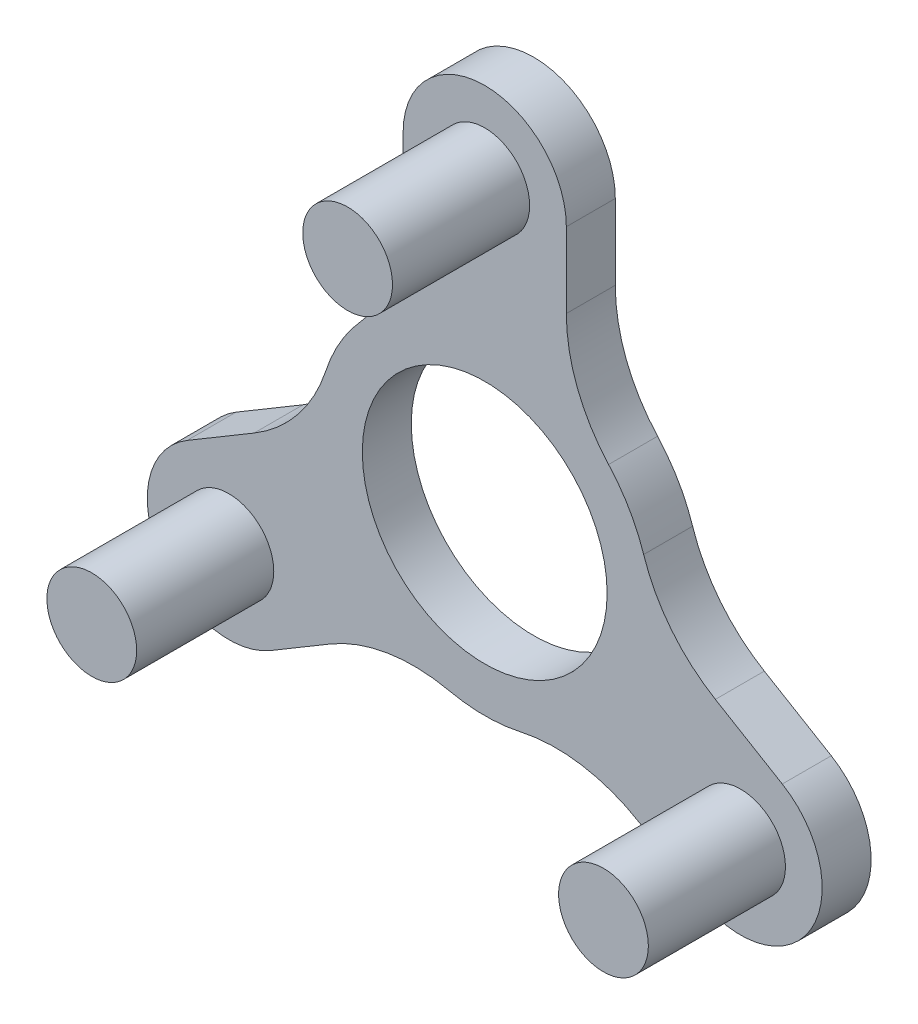
ISO-10303-21;
HEADER;
FILE_DESCRIPTION(('STEP AP214'),'2;1');
FILE_NAME('part.step','',(''),(''),'','','');
FILE_SCHEMA(('AUTOMOTIVE_DESIGN { 1 0 10303 214 1 1 1 1 }'));
ENDSEC;
DATA;
#1=APPLICATION_CONTEXT('core data for automotive mechanical design processes');
#2=APPLICATION_PROTOCOL_DEFINITION('international standard','automotive_design',2000,#1);
#3=PRODUCT_CONTEXT('',#1,'mechanical');
#4=PRODUCT('Part','Part','',(#3));
#5=PRODUCT_RELATED_PRODUCT_CATEGORY('part','',(#4));
#6=PRODUCT_DEFINITION_FORMATION('','',#4);
#7=PRODUCT_DEFINITION_CONTEXT('part definition',#1,'design');
#8=PRODUCT_DEFINITION('design','',#6,#7);
#9=PRODUCT_DEFINITION_SHAPE('','',#8);
#10=(LENGTH_UNIT() NAMED_UNIT(*) SI_UNIT(.MILLI.,.METRE.));
#11=(NAMED_UNIT(*) PLANE_ANGLE_UNIT() SI_UNIT($,.RADIAN.));
#12=(NAMED_UNIT(*) SI_UNIT($,.STERADIAN.) SOLID_ANGLE_UNIT());
#13=UNCERTAINTY_MEASURE_WITH_UNIT(LENGTH_MEASURE(1.E-05),#10,'distance_accuracy_value','');
#14=(GEOMETRIC_REPRESENTATION_CONTEXT(3) GLOBAL_UNCERTAINTY_ASSIGNED_CONTEXT((#13)) GLOBAL_UNIT_ASSIGNED_CONTEXT((#10,
#11,#12)) REPRESENTATION_CONTEXT('',''));
#15=CARTESIAN_POINT('',(0.,0.,0.));
#16=DIRECTION('',(0.,0.,1.));
#17=DIRECTION('',(1.,0.,0.));
#18=AXIS2_PLACEMENT_3D('',#15,#16,#17);
#19=CARTESIAN_POINT('',(-15.6750598084983,-9.05000000000008,3.));
#20=DIRECTION('',(0.,0.,-1.));
#21=DIRECTION('',(-1.,0.,0.));
#22=AXIS2_PLACEMENT_3D('',#19,#20,#21);
#23=CYLINDRICAL_SURFACE('',#22,5.);
#24=CARTESIAN_POINT('',(-15.6750598084983,-9.05000000000008,0.));
#25=DIRECTION('',(0.,0.,1.));
#26=DIRECTION('',(1.,0.,0.));
#27=AXIS2_PLACEMENT_3D('',#24,#25,#26);
#28=CIRCLE('',#27,5.);
#29=CARTESIAN_POINT('',(-18.2317713929619,-4.75311439832654,0.));
#30=VERTEX_POINT('',#29);
#31=CARTESIAN_POINT('',(-13.1183482240346,-13.3468856016736,0.));
#32=VERTEX_POINT('',#31);
#33=EDGE_CURVE('E255',#30,#32,#28,.T.);
#34=ORIENTED_EDGE('',*,*,#33,.T.);
#35=DIRECTION('',(0.,0.,-1.));
#36=VECTOR('',#35,1.);
#37=CARTESIAN_POINT('',(-13.1183482240346,-13.3468856016736,3.));
#38=LINE('',#37,#36);
#39=CARTESIAN_POINT('',(-13.1183482240346,-13.3468856016736,3.));
#40=VERTEX_POINT('',#39);
#41=EDGE_CURVE('E211',#40,#32,#38,.T.);
#42=ORIENTED_EDGE('',*,*,#41,.F.);
#43=CARTESIAN_POINT('',(-15.6750598084983,-9.05000000000008,3.));
#44=DIRECTION('',(0.,0.,1.));
#45=DIRECTION('',(1.,0.,0.));
#46=AXIS2_PLACEMENT_3D('',#43,#44,#45);
#47=CIRCLE('',#46,5.);
#48=CARTESIAN_POINT('',(-18.2317713929619,-4.75311439832654,3.));
#49=VERTEX_POINT('',#48);
#50=EDGE_CURVE('E214',#49,#40,#47,.T.);
#51=ORIENTED_EDGE('',*,*,#50,.F.);
#52=DIRECTION('',(0.,0.,-1.));
#53=VECTOR('',#52,1.);
#54=CARTESIAN_POINT('',(-18.2317713929619,-4.75311439832654,3.));
#55=LINE('',#54,#53);
#56=EDGE_CURVE('E199',#49,#30,#55,.T.);
#57=ORIENTED_EDGE('',*,*,#56,.T.);
#58=EDGE_LOOP('',(#34,#42,#51,#57));
#59=FACE_BOUND('',#58,.T.);
#60=ADVANCED_FACE('F74',(#59),#23,.T.);
#61=CARTESIAN_POINT('',(2.43503335375282,-4.09238954480285,3.));
#62=DIRECTION('',(-0.511342316892728,0.859377120334709,0.));
#63=DIRECTION('',(-0.859377120334709,-0.511342316892728,0.));
#64=AXIS2_PLACEMENT_3D('',#61,#62,#63);
#65=PLANE('',#64);
#66=DIRECTION('',(0.859377120334709,0.511342316892728,0.));
#67=VECTOR('',#66,1.);
#68=CARTESIAN_POINT('',(2.43503335375282,-4.09238954480285,0.));
#69=LINE('',#68,#67);
#70=CARTESIAN_POINT('',(-9.46922520496294,-11.1756025001734,0.));
#71=VERTEX_POINT('',#70);
#72=EDGE_CURVE('E258',#32,#71,#69,.T.);
#73=ORIENTED_EDGE('',*,*,#72,.T.);
#74=DIRECTION('',(0.,0.,1.));
#75=VECTOR('',#74,1.);
#76=CARTESIAN_POINT('',(-9.46922520496294,-11.1756025001734,3.));
#77=LINE('',#76,#75);
#78=CARTESIAN_POINT('',(-9.46922520496294,-11.1756025001734,3.));
#79=VERTEX_POINT('',#78);
#80=EDGE_CURVE('E89',#71,#79,#77,.T.);
#81=ORIENTED_EDGE('',*,*,#80,.T.);
#82=DIRECTION('',(0.859377120334709,0.511342316892728,0.));
#83=VECTOR('',#82,1.);
#84=CARTESIAN_POINT('',(2.43503335375282,-4.09238954480285,3.));
#85=LINE('',#84,#83);
#86=EDGE_CURVE('E217',#40,#79,#85,.T.);
#87=ORIENTED_EDGE('',*,*,#86,.F.);
#88=ORIENTED_EDGE('',*,*,#41,.T.);
#89=EDGE_LOOP('',(#73,#81,#87,#88));
#90=FACE_BOUND('',#89,.T.);
#91=ADVANCED_FACE('F353',(#90),#65,.F.);
#92=CARTESIAN_POINT('',(0.,0.,3.));
#93=DIRECTION('',(0.,0.,-1.));
#94=DIRECTION('',(-1.,0.,0.));
#95=AXIS2_PLACEMENT_3D('',#92,#93,#94);
#96=CYLINDRICAL_SURFACE('',#95,10.2435458358109);
#97=CARTESIAN_POINT('',(0.,0.,0.));
#98=DIRECTION('',(0.,0.,1.));
#99=DIRECTION('',(1.,0.,0.));
#100=AXIS2_PLACEMENT_3D('',#97,#98,#99);
#101=CIRCLE('',#100,10.2435458358109);
#102=CARTESIAN_POINT('',(-2.20410288640831,-10.0036074371442,0.));
#103=VERTEX_POINT('',#102);
#104=CARTESIAN_POINT('',(2.20410288640832,-10.0036074371442,0.));
#105=VERTEX_POINT('',#104);
#106=EDGE_CURVE('E229',#103,#105,#101,.T.);
#107=ORIENTED_EDGE('',*,*,#106,.T.);
#108=DIRECTION('',(0.,0.,-1.));
#109=VECTOR('',#108,1.);
#110=CARTESIAN_POINT('',(2.20410288640832,-10.0036074371442,3.));
#111=LINE('',#110,#109);
#112=CARTESIAN_POINT('',(2.20410288640832,-10.0036074371442,3.));
#113=VERTEX_POINT('',#112);
#114=EDGE_CURVE('E292',#105,#113,#111,.F.);
#115=ORIENTED_EDGE('',*,*,#114,.T.);
#116=CARTESIAN_POINT('',(0.,0.,3.));
#117=DIRECTION('',(0.,0.,1.));
#118=DIRECTION('',(1.,0.,0.));
#119=AXIS2_PLACEMENT_3D('',#116,#117,#118);
#120=CIRCLE('',#119,10.2435458358109);
#121=CARTESIAN_POINT('',(-2.20410288640831,-10.0036074371442,3.));
#122=VERTEX_POINT('',#121);
#123=EDGE_CURVE('E235',#122,#113,#120,.T.);
#124=ORIENTED_EDGE('',*,*,#123,.F.);
#125=DIRECTION('',(0.,0.,-1.));
#126=VECTOR('',#125,1.);
#127=CARTESIAN_POINT('',(-2.20410288640831,-10.0036074371442,3.));
#128=LINE('',#127,#126);
#129=EDGE_CURVE('E289',#122,#103,#128,.T.);
#130=ORIENTED_EDGE('',*,*,#129,.T.);
#131=EDGE_LOOP('',(#107,#115,#124,#130));
#132=FACE_BOUND('',#131,.T.);
#133=ADVANCED_FACE('F358',(#132),#96,.T.);
#134=CARTESIAN_POINT('',(-2.43503335375282,-4.09238954480286,3.));
#135=DIRECTION('',(-0.511342316892728,-0.859377120334709,0.));
#136=DIRECTION('',(0.859377120334709,-0.511342316892728,0.));
#137=AXIS2_PLACEMENT_3D('',#134,#135,#136);
#138=PLANE('',#137);
#139=DIRECTION('',(-0.859377120334709,0.511342316892728,0.));
#140=VECTOR('',#139,1.);
#141=CARTESIAN_POINT('',(-2.43503335375282,-4.09238954480286,3.));
#142=LINE('',#141,#140);
#143=CARTESIAN_POINT('',(13.1183482240346,-13.3468856016736,3.));
#144=VERTEX_POINT('',#143);
#145=CARTESIAN_POINT('',(9.46922520496294,-11.1756025001734,3.));
#146=VERTEX_POINT('',#145);
#147=EDGE_CURVE('E241',#144,#146,#142,.T.);
#148=ORIENTED_EDGE('',*,*,#147,.T.);
#149=DIRECTION('',(0.,0.,-1.));
#150=VECTOR('',#149,1.);
#151=CARTESIAN_POINT('',(9.46922520496294,-11.1756025001734,3.));
#152=LINE('',#151,#150);
#153=CARTESIAN_POINT('',(9.46922520496294,-11.1756025001734,0.));
#154=VERTEX_POINT('',#153);
#155=EDGE_CURVE('E210',#146,#154,#152,.T.);
#156=ORIENTED_EDGE('',*,*,#155,.T.);
#157=DIRECTION('',(-0.859377120334709,0.511342316892728,0.));
#158=VECTOR('',#157,1.);
#159=CARTESIAN_POINT('',(-2.43503335375282,-4.09238954480286,0.));
#160=LINE('',#159,#158);
#161=CARTESIAN_POINT('',(13.1183482240346,-13.3468856016736,0.));
#162=VERTEX_POINT('',#161);
#163=EDGE_CURVE('E260',#162,#154,#160,.T.);
#164=ORIENTED_EDGE('',*,*,#163,.F.);
#165=DIRECTION('',(0.,0.,-1.));
#166=VECTOR('',#165,1.);
#167=CARTESIAN_POINT('',(13.1183482240346,-13.3468856016736,3.));
#168=LINE('',#167,#166);
#169=EDGE_CURVE('E279',#144,#162,#168,.T.);
#170=ORIENTED_EDGE('',*,*,#169,.F.);
#171=EDGE_LOOP('',(#148,#156,#164,#170));
#172=FACE_BOUND('',#171,.T.);
#173=ADVANCED_FACE('F416',(#172),#138,.T.);
#174=CARTESIAN_POINT('',(2.67838981517445,4.50138165854423,3.));
#175=DIRECTION('',(-0.511342316892728,-0.859377120334709,0.));
#176=DIRECTION('',(0.859377120334709,-0.511342316892728,0.));
#177=AXIS2_PLACEMENT_3D('',#174,#175,#176);
#178=PLANE('',#177);
#179=DIRECTION('',(-0.859377120334709,0.511342316892728,0.));
#180=VECTOR('',#179,1.);
#181=CARTESIAN_POINT('',(2.67838981517445,4.50138165854423,0.));
#182=LINE('',#181,#180);
#183=CARTESIAN_POINT('',(18.2317713929619,-4.75311439832654,0.));
#184=VERTEX_POINT('',#183);
#185=CARTESIAN_POINT('',(14.1312068435024,-2.31321679380084,0.));
#186=VERTEX_POINT('',#185);
#187=EDGE_CURVE('E263',#184,#186,#182,.T.);
#188=ORIENTED_EDGE('',*,*,#187,.T.);
#189=DIRECTION('',(0.,0.,1.));
#190=VECTOR('',#189,1.);
#191=CARTESIAN_POINT('',(14.1312068435024,-2.31321679380084,3.));
#192=LINE('',#191,#190);
#193=CARTESIAN_POINT('',(14.1312068435024,-2.31321679380084,3.));
#194=VERTEX_POINT('',#193);
#195=EDGE_CURVE('E299',#186,#194,#192,.T.);
#196=ORIENTED_EDGE('',*,*,#195,.T.);
#197=DIRECTION('',(-0.859377120334709,0.511342316892728,0.));
#198=VECTOR('',#197,1.);
#199=CARTESIAN_POINT('',(2.67838981517445,4.50138165854423,3.));
#200=LINE('',#199,#198);
#201=CARTESIAN_POINT('',(18.2317713929619,-4.75311439832654,3.));
#202=VERTEX_POINT('',#201);
#203=EDGE_CURVE('E244',#202,#194,#200,.T.);
#204=ORIENTED_EDGE('',*,*,#203,.F.);
#205=DIRECTION('',(0.,0.,-1.));
#206=VECTOR('',#205,1.);
#207=CARTESIAN_POINT('',(18.2317713929619,-4.75311439832654,3.));
#208=LINE('',#207,#206);
#209=EDGE_CURVE('E277',#202,#184,#208,.T.);
#210=ORIENTED_EDGE('',*,*,#209,.T.);
#211=EDGE_LOOP('',(#188,#196,#204,#210));
#212=FACE_BOUND('',#211,.T.);
#213=ADVANCED_FACE('F414',(#212),#178,.F.);
#214=CARTESIAN_POINT('',(9.73807905119151,3.17805721834967,3.));
#215=VERTEX_POINT('',#214);
#216=CARTESIAN_POINT('',(7.59023092018547,6.87885352864995,3.));
#217=VERTEX_POINT('',#216);
#218=EDGE_CURVE('E240',#215,#217,#120,.T.);
#219=ORIENTED_EDGE('',*,*,#218,.F.);
#220=DIRECTION('',(0.,0.,-1.));
#221=VECTOR('',#220,1.);
#222=CARTESIAN_POINT('',(9.73807905119151,3.17805721834967,3.));
#223=LINE('',#222,#221);
#224=CARTESIAN_POINT('',(9.73807905119151,3.17805721834967,0.));
#225=VERTEX_POINT('',#224);
#226=EDGE_CURVE('E296',#215,#225,#223,.T.);
#227=ORIENTED_EDGE('',*,*,#226,.T.);
#228=CARTESIAN_POINT('',(7.59023092018547,6.87885352864995,0.));
#229=VERTEX_POINT('',#228);
#230=EDGE_CURVE('E228',#225,#229,#101,.T.);
#231=ORIENTED_EDGE('',*,*,#230,.T.);
#232=DIRECTION('',(0.,0.,-1.));
#233=VECTOR('',#232,1.);
#234=CARTESIAN_POINT('',(7.59023092018547,6.87885352864995,3.));
#235=LINE('',#234,#233);
#236=EDGE_CURVE('E294',#229,#217,#235,.F.);
#237=ORIENTED_EDGE('',*,*,#236,.T.);
#238=EDGE_LOOP('',(#219,#227,#231,#237));
#239=FACE_BOUND('',#238,.T.);
#240=ADVANCED_FACE('F408',(#239),#96,.T.);
#241=CARTESIAN_POINT('',(5.,0.,3.));
#242=DIRECTION('',(1.,0.,0.));
#243=DIRECTION('',(0.,1.,0.));
#244=AXIS2_PLACEMENT_3D('',#241,#242,#243);
#245=PLANE('',#244);
#246=DIRECTION('',(0.,-1.,0.));
#247=VECTOR('',#246,1.);
#248=CARTESIAN_POINT('',(5.,0.,3.));
#249=LINE('',#248,#247);
#250=CARTESIAN_POINT('',(5.,18.2,3.));
#251=VERTEX_POINT('',#250);
#252=CARTESIAN_POINT('',(5.,13.5941585986989,3.));
#253=VERTEX_POINT('',#252);
#254=EDGE_CURVE('E247',#251,#253,#249,.T.);
#255=ORIENTED_EDGE('',*,*,#254,.T.);
#256=DIRECTION('',(0.,0.,-1.));
#257=VECTOR('',#256,1.);
#258=CARTESIAN_POINT('',(5.,13.5941585986989,3.));
#259=LINE('',#258,#257);
#260=CARTESIAN_POINT('',(5.,13.5941585986989,0.));
#261=VERTEX_POINT('',#260);
#262=EDGE_CURVE('E301',#253,#261,#259,.T.);
#263=ORIENTED_EDGE('',*,*,#262,.T.);
#264=DIRECTION('',(0.,-1.,0.));
#265=VECTOR('',#264,1.);
#266=CARTESIAN_POINT('',(5.,0.,0.));
#267=LINE('',#266,#265);
#268=CARTESIAN_POINT('',(5.,18.2,0.));
#269=VERTEX_POINT('',#268);
#270=EDGE_CURVE('E266',#269,#261,#267,.T.);
#271=ORIENTED_EDGE('',*,*,#270,.F.);
#272=DIRECTION('',(0.,0.,-1.));
#273=VECTOR('',#272,1.);
#274=CARTESIAN_POINT('',(5.,18.2,3.));
#275=LINE('',#274,#273);
#276=EDGE_CURVE('E275',#251,#269,#275,.T.);
#277=ORIENTED_EDGE('',*,*,#276,.F.);
#278=EDGE_LOOP('',(#255,#263,#271,#277));
#279=FACE_BOUND('',#278,.T.);
#280=ADVANCED_FACE('F388',(#279),#245,.T.);
#281=CARTESIAN_POINT('',(0.,18.2,3.));
#282=DIRECTION('',(0.,0.,-1.));
#283=DIRECTION('',(-1.,0.,0.));
#284=AXIS2_PLACEMENT_3D('',#281,#282,#283);
#285=CYLINDRICAL_SURFACE('',#284,5.);
#286=CARTESIAN_POINT('',(0.,18.2,0.));
#287=DIRECTION('',(0.,0.,1.));
#288=DIRECTION('',(1.,0.,0.));
#289=AXIS2_PLACEMENT_3D('',#286,#287,#288);
#290=CIRCLE('',#289,5.);
#291=CARTESIAN_POINT('',(-5.,18.2,0.));
#292=VERTEX_POINT('',#291);
#293=EDGE_CURVE('E269',#269,#292,#290,.T.);
#294=ORIENTED_EDGE('',*,*,#293,.T.);
#295=DIRECTION('',(0.,0.,-1.));
#296=VECTOR('',#295,1.);
#297=CARTESIAN_POINT('',(-5.,18.2,3.));
#298=LINE('',#297,#296);
#299=CARTESIAN_POINT('',(-5.,18.2,3.));
#300=VERTEX_POINT('',#299);
#301=EDGE_CURVE('E238',#300,#292,#298,.T.);
#302=ORIENTED_EDGE('',*,*,#301,.F.);
#303=CARTESIAN_POINT('',(0.,18.2,3.));
#304=DIRECTION('',(0.,0.,1.));
#305=DIRECTION('',(1.,0.,0.));
#306=AXIS2_PLACEMENT_3D('',#303,#304,#305);
#307=CIRCLE('',#306,5.);
#308=EDGE_CURVE('E250',#251,#300,#307,.T.);
#309=ORIENTED_EDGE('',*,*,#308,.F.);
#310=ORIENTED_EDGE('',*,*,#276,.T.);
#311=EDGE_LOOP('',(#294,#302,#309,#310));
#312=FACE_BOUND('',#311,.T.);
#313=ADVANCED_FACE('F394',(#312),#285,.T.);
#314=CARTESIAN_POINT('',(-5.,0.,3.));
#315=DIRECTION('',(1.,0.,0.));
#316=DIRECTION('',(0.,1.,0.));
#317=AXIS2_PLACEMENT_3D('',#314,#315,#316);
#318=PLANE('',#317);
#319=DIRECTION('',(0.,-1.,0.));
#320=VECTOR('',#319,1.);
#321=CARTESIAN_POINT('',(-5.,0.,0.));
#322=LINE('',#321,#320);
#323=CARTESIAN_POINT('',(-5.,13.5941585986989,0.));
#324=VERTEX_POINT('',#323);
#325=EDGE_CURVE('E226',#292,#324,#322,.T.);
#326=ORIENTED_EDGE('',*,*,#325,.T.);
#327=DIRECTION('',(0.,0.,1.));
#328=VECTOR('',#327,1.);
#329=CARTESIAN_POINT('',(-5.,13.5941585986989,3.));
#330=LINE('',#329,#328);
#331=CARTESIAN_POINT('',(-5.,13.5941585986989,3.));
#332=VERTEX_POINT('',#331);
#333=EDGE_CURVE('E309',#324,#332,#330,.T.);
#334=ORIENTED_EDGE('',*,*,#333,.T.);
#335=DIRECTION('',(0.,-1.,0.));
#336=VECTOR('',#335,1.);
#337=CARTESIAN_POINT('',(-5.,0.,3.));
#338=LINE('',#337,#336);
#339=EDGE_CURVE('E239',#300,#332,#338,.T.);
#340=ORIENTED_EDGE('',*,*,#339,.F.);
#341=ORIENTED_EDGE('',*,*,#301,.T.);
#342=EDGE_LOOP('',(#326,#334,#340,#341));
#343=FACE_BOUND('',#342,.T.);
#344=ADVANCED_FACE('F400',(#343),#318,.F.);
#345=CARTESIAN_POINT('',(-7.59023092018547,6.87885352864995,3.));
#346=VERTEX_POINT('',#345);
#347=CARTESIAN_POINT('',(-9.73807905119151,3.17805721834968,3.));
#348=VERTEX_POINT('',#347);
#349=EDGE_CURVE('E236',#346,#348,#120,.T.);
#350=ORIENTED_EDGE('',*,*,#349,.F.);
#351=DIRECTION('',(0.,0.,-1.));
#352=VECTOR('',#351,1.);
#353=CARTESIAN_POINT('',(-7.59023092018547,6.87885352864995,3.));
#354=LINE('',#353,#352);
#355=CARTESIAN_POINT('',(-7.59023092018547,6.87885352864995,0.));
#356=VERTEX_POINT('',#355);
#357=EDGE_CURVE('E306',#346,#356,#354,.T.);
#358=ORIENTED_EDGE('',*,*,#357,.T.);
#359=CARTESIAN_POINT('',(-9.73807905119151,3.17805721834968,0.));
#360=VERTEX_POINT('',#359);
#361=EDGE_CURVE('E223',#356,#360,#101,.T.);
#362=ORIENTED_EDGE('',*,*,#361,.T.);
#363=DIRECTION('',(0.,0.,-1.));
#364=VECTOR('',#363,1.);
#365=CARTESIAN_POINT('',(-9.73807905119151,3.17805721834968,3.));
#366=LINE('',#365,#364);
#367=EDGE_CURVE('E304',#360,#348,#366,.F.);
#368=ORIENTED_EDGE('',*,*,#367,.T.);
#369=EDGE_LOOP('',(#350,#358,#362,#368));
#370=FACE_BOUND('',#369,.T.);
#371=ADVANCED_FACE('F338',(#370),#96,.T.);
#372=CARTESIAN_POINT('',(-2.67838981517446,4.50138165854424,3.));
#373=DIRECTION('',(-0.511342316892728,0.859377120334709,0.));
#374=DIRECTION('',(-0.859377120334709,-0.511342316892728,0.));
#375=AXIS2_PLACEMENT_3D('',#372,#373,#374);
#376=PLANE('',#375);
#377=DIRECTION('',(0.859377120334709,0.511342316892728,0.));
#378=VECTOR('',#377,1.);
#379=CARTESIAN_POINT('',(-2.67838981517446,4.50138165854424,3.));
#380=LINE('',#379,#378);
#381=CARTESIAN_POINT('',(-14.1312068435023,-2.31321679380083,3.));
#382=VERTEX_POINT('',#381);
#383=EDGE_CURVE('E204',#49,#382,#380,.T.);
#384=ORIENTED_EDGE('',*,*,#383,.T.);
#385=DIRECTION('',(0.,0.,-1.));
#386=VECTOR('',#385,1.);
#387=CARTESIAN_POINT('',(-14.1312068435023,-2.31321679380083,3.));
#388=LINE('',#387,#386);
#389=CARTESIAN_POINT('',(-14.1312068435023,-2.31321679380083,0.));
#390=VERTEX_POINT('',#389);
#391=EDGE_CURVE('E311',#382,#390,#388,.T.);
#392=ORIENTED_EDGE('',*,*,#391,.T.);
#393=DIRECTION('',(0.859377120334709,0.511342316892728,0.));
#394=VECTOR('',#393,1.);
#395=CARTESIAN_POINT('',(-2.67838981517446,4.50138165854424,0.));
#396=LINE('',#395,#394);
#397=EDGE_CURVE('E207',#30,#390,#396,.T.);
#398=ORIENTED_EDGE('',*,*,#397,.F.);
#399=ORIENTED_EDGE('',*,*,#56,.F.);
#400=EDGE_LOOP('',(#384,#392,#398,#399));
#401=FACE_BOUND('',#400,.T.);
#402=ADVANCED_FACE('F201',(#401),#376,.T.);
#403=CARTESIAN_POINT('',(0.,0.,0.));
#404=DIRECTION('',(0.,0.,1.));
#405=DIRECTION('',(1.,0.,0.));
#406=AXIS2_PLACEMENT_3D('',#403,#404,#405);
#407=PLANE('',#406);
#408=CARTESIAN_POINT('',(0.,0.,0.));
#409=DIRECTION('',(0.,0.,1.));
#410=DIRECTION('',(1.,0.,0.));
#411=AXIS2_PLACEMENT_3D('',#408,#409,#410);
#412=CIRCLE('',#411,7.5);
#413=CARTESIAN_POINT('',(7.5,0.,0.));
#414=VERTEX_POINT('',#413);
#415=EDGE_CURVE('E231',#414,#414,#412,.T.);
#416=ORIENTED_EDGE('',*,*,#415,.T.);
#417=EDGE_LOOP('',(#416));
#418=FACE_BOUND('',#417,.T.);
#419=ORIENTED_EDGE('',*,*,#397,.T.);
#420=CARTESIAN_POINT('',(-19.2446300124296,6.28055440954626,0.));
#421=DIRECTION('',(0.,0.,1.));
#422=DIRECTION('',(1.,0.,0.));
#423=AXIS2_PLACEMENT_3D('',#420,#421,#422);
#424=CIRCLE('',#423,10.);
#425=EDGE_CURVE('E330',#390,#360,#424,.T.);
#426=ORIENTED_EDGE('',*,*,#425,.T.);
#427=ORIENTED_EDGE('',*,*,#361,.F.);
#428=CARTESIAN_POINT('',(-15.,13.5941585986989,0.));
#429=DIRECTION('',(0.,0.,1.));
#430=DIRECTION('',(1.,0.,0.));
#431=AXIS2_PLACEMENT_3D('',#428,#429,#430);
#432=CIRCLE('',#431,10.);
#433=EDGE_CURVE('E326',#356,#324,#432,.T.);
#434=ORIENTED_EDGE('',*,*,#433,.T.);
#435=ORIENTED_EDGE('',*,*,#325,.F.);
#436=ORIENTED_EDGE('',*,*,#293,.F.);
#437=ORIENTED_EDGE('',*,*,#270,.T.);
#438=CARTESIAN_POINT('',(15.,13.5941585986989,0.));
#439=DIRECTION('',(0.,0.,1.));
#440=DIRECTION('',(1.,0.,0.));
#441=AXIS2_PLACEMENT_3D('',#438,#439,#440);
#442=CIRCLE('',#441,10.);
#443=EDGE_CURVE('E322',#261,#229,#442,.T.);
#444=ORIENTED_EDGE('',*,*,#443,.T.);
#445=ORIENTED_EDGE('',*,*,#230,.F.);
#446=CARTESIAN_POINT('',(19.2446300124296,6.28055440954625,0.));
#447=DIRECTION('',(0.,0.,1.));
#448=DIRECTION('',(1.,0.,0.));
#449=AXIS2_PLACEMENT_3D('',#446,#447,#448);
#450=CIRCLE('',#449,10.);
#451=EDGE_CURVE('E318',#225,#186,#450,.T.);
#452=ORIENTED_EDGE('',*,*,#451,.T.);
#453=ORIENTED_EDGE('',*,*,#187,.F.);
#454=CARTESIAN_POINT('',(15.6750598084983,-9.05000000000008,0.));
#455=DIRECTION('',(0.,0.,1.));
#456=DIRECTION('',(1.,0.,0.));
#457=AXIS2_PLACEMENT_3D('',#454,#455,#456);
#458=CIRCLE('',#457,5.);
#459=EDGE_CURVE('E284',#162,#184,#458,.T.);
#460=ORIENTED_EDGE('',*,*,#459,.F.);
#461=ORIENTED_EDGE('',*,*,#163,.T.);
#462=CARTESIAN_POINT('',(4.35580203603567,-19.7693737035204,0.));
#463=DIRECTION('',(0.,0.,1.));
#464=DIRECTION('',(1.,0.,0.));
#465=AXIS2_PLACEMENT_3D('',#462,#463,#464);
#466=CIRCLE('',#465,10.);
#467=EDGE_CURVE('E314',#154,#105,#466,.T.);
#468=ORIENTED_EDGE('',*,*,#467,.T.);
#469=ORIENTED_EDGE('',*,*,#106,.F.);
#470=CARTESIAN_POINT('',(-4.35580203603566,-19.7693737035204,0.));
#471=DIRECTION('',(0.,0.,1.));
#472=DIRECTION('',(1.,0.,0.));
#473=AXIS2_PLACEMENT_3D('',#470,#471,#472);
#474=CIRCLE('',#473,10.);
#475=EDGE_CURVE('E82',#103,#71,#474,.T.);
#476=ORIENTED_EDGE('',*,*,#475,.T.);
#477=ORIENTED_EDGE('',*,*,#72,.F.);
#478=ORIENTED_EDGE('',*,*,#33,.F.);
#479=EDGE_LOOP('',(#419,#426,#427,#434,#435,#436,#437,#444,#445,#452,#453,#460,#461,#468,#469,
#476,#477,#478));
#480=FACE_BOUND('',#479,.T.);
#481=ADVANCED_FACE('F333',(#418,#480),#407,.F.);
#482=CARTESIAN_POINT('',(0.,0.,3.));
#483=DIRECTION('',(0.,0.,1.));
#484=DIRECTION('',(1.,0.,0.));
#485=AXIS2_PLACEMENT_3D('',#482,#483,#484);
#486=PLANE('',#485);
#487=CARTESIAN_POINT('',(-15.6750598084983,-9.05000000000008,3.));
#488=DIRECTION('',(0.,0.,1.));
#489=DIRECTION('',(1.,0.,0.));
#490=AXIS2_PLACEMENT_3D('',#487,#488,#489);
#491=CIRCLE('',#490,2.75);
#492=CARTESIAN_POINT('',(-12.9250598084983,-9.05000000000008,3.));
#493=VERTEX_POINT('',#492);
#494=EDGE_CURVE('E629',#493,#493,#491,.T.);
#495=ORIENTED_EDGE('',*,*,#494,.F.);
#496=EDGE_LOOP('',(#495));
#497=FACE_BOUND('',#496,.T.);
#498=CARTESIAN_POINT('',(15.6750598084983,-9.05000000000008,3.));
#499=DIRECTION('',(0.,0.,1.));
#500=DIRECTION('',(1.,0.,0.));
#501=AXIS2_PLACEMENT_3D('',#498,#499,#500);
#502=CIRCLE('',#501,2.75);
#503=CARTESIAN_POINT('',(18.4250598084983,-9.05000000000008,3.));
#504=VERTEX_POINT('',#503);
#505=EDGE_CURVE('E623',#504,#504,#502,.T.);
#506=ORIENTED_EDGE('',*,*,#505,.F.);
#507=EDGE_LOOP('',(#506));
#508=FACE_BOUND('',#507,.T.);
#509=CARTESIAN_POINT('',(0.,18.2,3.));
#510=DIRECTION('',(0.,0.,1.));
#511=DIRECTION('',(1.,0.,0.));
#512=AXIS2_PLACEMENT_3D('',#509,#510,#511);
#513=CIRCLE('',#512,2.75);
#514=CARTESIAN_POINT('',(2.75,18.2,3.));
#515=VERTEX_POINT('',#514);
#516=EDGE_CURVE('E617',#515,#515,#513,.T.);
#517=ORIENTED_EDGE('',*,*,#516,.F.);
#518=EDGE_LOOP('',(#517));
#519=FACE_BOUND('',#518,.T.);
#520=CARTESIAN_POINT('',(0.,0.,3.));
#521=DIRECTION('',(0.,0.,1.));
#522=DIRECTION('',(1.,0.,0.));
#523=AXIS2_PLACEMENT_3D('',#520,#521,#522);
#524=CIRCLE('',#523,7.5);
#525=CARTESIAN_POINT('',(7.5,0.,3.));
#526=VERTEX_POINT('',#525);
#527=EDGE_CURVE('E612',#526,#526,#524,.T.);
#528=ORIENTED_EDGE('',*,*,#527,.F.);
#529=EDGE_LOOP('',(#528));
#530=FACE_BOUND('',#529,.T.);
#531=ORIENTED_EDGE('',*,*,#383,.F.);
#532=ORIENTED_EDGE('',*,*,#50,.T.);
#533=ORIENTED_EDGE('',*,*,#86,.T.);
#534=CARTESIAN_POINT('',(-4.35580203603566,-19.7693737035204,3.));
#535=DIRECTION('',(0.,0.,1.));
#536=DIRECTION('',(1.,0.,0.));
#537=AXIS2_PLACEMENT_3D('',#534,#535,#536);
#538=CIRCLE('',#537,10.);
#539=EDGE_CURVE('E12',#79,#122,#538,.F.);
#540=ORIENTED_EDGE('',*,*,#539,.T.);
#541=ORIENTED_EDGE('',*,*,#123,.T.);
#542=CARTESIAN_POINT('',(4.35580203603567,-19.7693737035204,3.));
#543=DIRECTION('',(0.,0.,1.));
#544=DIRECTION('',(1.,0.,0.));
#545=AXIS2_PLACEMENT_3D('',#542,#543,#544);
#546=CIRCLE('',#545,10.);
#547=EDGE_CURVE('E316',#113,#146,#546,.F.);
#548=ORIENTED_EDGE('',*,*,#547,.T.);
#549=ORIENTED_EDGE('',*,*,#147,.F.);
#550=CARTESIAN_POINT('',(15.6750598084983,-9.05000000000008,3.));
#551=DIRECTION('',(0.,0.,1.));
#552=DIRECTION('',(1.,0.,0.));
#553=AXIS2_PLACEMENT_3D('',#550,#551,#552);
#554=CIRCLE('',#553,5.);
#555=EDGE_CURVE('E256',#144,#202,#554,.T.);
#556=ORIENTED_EDGE('',*,*,#555,.T.);
#557=ORIENTED_EDGE('',*,*,#203,.T.);
#558=CARTESIAN_POINT('',(19.2446300124296,6.28055440954625,3.));
#559=DIRECTION('',(0.,0.,1.));
#560=DIRECTION('',(1.,0.,0.));
#561=AXIS2_PLACEMENT_3D('',#558,#559,#560);
#562=CIRCLE('',#561,10.);
#563=EDGE_CURVE('E320',#194,#215,#562,.F.);
#564=ORIENTED_EDGE('',*,*,#563,.T.);
#565=ORIENTED_EDGE('',*,*,#218,.T.);
#566=CARTESIAN_POINT('',(15.,13.5941585986989,3.));
#567=DIRECTION('',(0.,0.,1.));
#568=DIRECTION('',(1.,0.,0.));
#569=AXIS2_PLACEMENT_3D('',#566,#567,#568);
#570=CIRCLE('',#569,10.);
#571=EDGE_CURVE('E324',#217,#253,#570,.F.);
#572=ORIENTED_EDGE('',*,*,#571,.T.);
#573=ORIENTED_EDGE('',*,*,#254,.F.);
#574=ORIENTED_EDGE('',*,*,#308,.T.);
#575=ORIENTED_EDGE('',*,*,#339,.T.);
#576=CARTESIAN_POINT('',(-15.,13.5941585986989,3.));
#577=DIRECTION('',(0.,0.,1.));
#578=DIRECTION('',(1.,0.,0.));
#579=AXIS2_PLACEMENT_3D('',#576,#577,#578);
#580=CIRCLE('',#579,10.);
#581=EDGE_CURVE('E328',#332,#346,#580,.F.);
#582=ORIENTED_EDGE('',*,*,#581,.T.);
#583=ORIENTED_EDGE('',*,*,#349,.T.);
#584=CARTESIAN_POINT('',(-19.2446300124296,6.28055440954626,3.));
#585=DIRECTION('',(0.,0.,1.));
#586=DIRECTION('',(1.,0.,0.));
#587=AXIS2_PLACEMENT_3D('',#584,#585,#586);
#588=CIRCLE('',#587,10.);
#589=EDGE_CURVE('E222',#348,#382,#588,.F.);
#590=ORIENTED_EDGE('',*,*,#589,.T.);
#591=EDGE_LOOP('',(#531,#532,#533,#540,#541,#548,#549,#556,#557,#564,#565,#572,#573,#574,#575,
#582,#583,#590));
#592=FACE_BOUND('',#591,.T.);
#593=ADVANCED_FACE('F219',(#497,#508,#519,#530,#592),#486,.T.);
#594=CARTESIAN_POINT('',(15.6750598084983,-9.05000000000008,3.));
#595=DIRECTION('',(0.,0.,-1.));
#596=DIRECTION('',(-1.,0.,0.));
#597=AXIS2_PLACEMENT_3D('',#594,#595,#596);
#598=CYLINDRICAL_SURFACE('',#597,5.);
#599=ORIENTED_EDGE('',*,*,#169,.T.);
#600=ORIENTED_EDGE('',*,*,#459,.T.);
#601=ORIENTED_EDGE('',*,*,#209,.F.);
#602=ORIENTED_EDGE('',*,*,#555,.F.);
#603=EDGE_LOOP('',(#599,#600,#601,#602));
#604=FACE_BOUND('',#603,.T.);
#605=ADVANCED_FACE('F364',(#604),#598,.T.);
#606=CARTESIAN_POINT('',(0.,0.,-7.));
#607=DIRECTION('',(0.,0.,1.));
#608=DIRECTION('',(1.,0.,0.));
#609=AXIS2_PLACEMENT_3D('',#606,#607,#608);
#610=CYLINDRICAL_SURFACE('',#609,7.5);
#611=ORIENTED_EDGE('',*,*,#527,.T.);
#612=EDGE_LOOP('',(#611));
#613=FACE_BOUND('',#612,.T.);
#614=ORIENTED_EDGE('',*,*,#415,.F.);
#615=EDGE_LOOP('',(#614));
#616=FACE_BOUND('',#615,.T.);
#617=ADVANCED_FACE('F367',(#613,#616),#610,.F.);
#618=CARTESIAN_POINT('',(4.35580203603567,-19.7693737035204,3.));
#619=DIRECTION('',(0.,0.,-1.));
#620=DIRECTION('',(-1.,0.,0.));
#621=AXIS2_PLACEMENT_3D('',#618,#619,#620);
#622=CYLINDRICAL_SURFACE('',#621,10.);
#623=ORIENTED_EDGE('',*,*,#547,.F.);
#624=ORIENTED_EDGE('',*,*,#114,.F.);
#625=ORIENTED_EDGE('',*,*,#467,.F.);
#626=ORIENTED_EDGE('',*,*,#155,.F.);
#627=EDGE_LOOP('',(#623,#624,#625,#626));
#628=FACE_BOUND('',#627,.T.);
#629=ADVANCED_FACE('F369',(#628),#622,.F.);
#630=CARTESIAN_POINT('',(19.2446300124296,6.28055440954625,3.));
#631=DIRECTION('',(0.,0.,-1.));
#632=DIRECTION('',(-1.,0.,0.));
#633=AXIS2_PLACEMENT_3D('',#630,#631,#632);
#634=CYLINDRICAL_SURFACE('',#633,10.);
#635=ORIENTED_EDGE('',*,*,#563,.F.);
#636=ORIENTED_EDGE('',*,*,#195,.F.);
#637=ORIENTED_EDGE('',*,*,#451,.F.);
#638=ORIENTED_EDGE('',*,*,#226,.F.);
#639=EDGE_LOOP('',(#635,#636,#637,#638));
#640=FACE_BOUND('',#639,.T.);
#641=ADVANCED_FACE('F372',(#640),#634,.F.);
#642=CARTESIAN_POINT('',(15.,13.5941585986989,3.));
#643=DIRECTION('',(0.,0.,-1.));
#644=DIRECTION('',(-1.,0.,0.));
#645=AXIS2_PLACEMENT_3D('',#642,#643,#644);
#646=CYLINDRICAL_SURFACE('',#645,10.);
#647=ORIENTED_EDGE('',*,*,#571,.F.);
#648=ORIENTED_EDGE('',*,*,#236,.F.);
#649=ORIENTED_EDGE('',*,*,#443,.F.);
#650=ORIENTED_EDGE('',*,*,#262,.F.);
#651=EDGE_LOOP('',(#647,#648,#649,#650));
#652=FACE_BOUND('',#651,.T.);
#653=ADVANCED_FACE('F349',(#652),#646,.F.);
#654=CARTESIAN_POINT('',(-15.,13.5941585986989,3.));
#655=DIRECTION('',(0.,0.,-1.));
#656=DIRECTION('',(-1.,0.,0.));
#657=AXIS2_PLACEMENT_3D('',#654,#655,#656);
#658=CYLINDRICAL_SURFACE('',#657,10.);
#659=ORIENTED_EDGE('',*,*,#581,.F.);
#660=ORIENTED_EDGE('',*,*,#333,.F.);
#661=ORIENTED_EDGE('',*,*,#433,.F.);
#662=ORIENTED_EDGE('',*,*,#357,.F.);
#663=EDGE_LOOP('',(#659,#660,#661,#662));
#664=FACE_BOUND('',#663,.T.);
#665=ADVANCED_FACE('F342',(#664),#658,.F.);
#666=CARTESIAN_POINT('',(-19.2446300124296,6.28055440954626,3.));
#667=DIRECTION('',(0.,0.,-1.));
#668=DIRECTION('',(-1.,0.,0.));
#669=AXIS2_PLACEMENT_3D('',#666,#667,#668);
#670=CYLINDRICAL_SURFACE('',#669,10.);
#671=ORIENTED_EDGE('',*,*,#589,.F.);
#672=ORIENTED_EDGE('',*,*,#367,.F.);
#673=ORIENTED_EDGE('',*,*,#425,.F.);
#674=ORIENTED_EDGE('',*,*,#391,.F.);
#675=EDGE_LOOP('',(#671,#672,#673,#674));
#676=FACE_BOUND('',#675,.T.);
#677=ADVANCED_FACE('F340',(#676),#670,.F.);
#678=CARTESIAN_POINT('',(-4.35580203603566,-19.7693737035204,3.));
#679=DIRECTION('',(0.,0.,-1.));
#680=DIRECTION('',(-1.,0.,0.));
#681=AXIS2_PLACEMENT_3D('',#678,#679,#680);
#682=CYLINDRICAL_SURFACE('',#681,10.);
#683=ORIENTED_EDGE('',*,*,#539,.F.);
#684=ORIENTED_EDGE('',*,*,#80,.F.);
#685=ORIENTED_EDGE('',*,*,#475,.F.);
#686=ORIENTED_EDGE('',*,*,#129,.F.);
#687=EDGE_LOOP('',(#683,#684,#685,#686));
#688=FACE_BOUND('',#687,.T.);
#689=ADVANCED_FACE('F76',(#688),#682,.F.);
#690=CARTESIAN_POINT('',(0.,18.2,11.4));
#691=DIRECTION('',(0.,0.,-1.));
#692=DIRECTION('',(-1.,0.,0.));
#693=AXIS2_PLACEMENT_3D('',#690,#691,#692);
#694=CYLINDRICAL_SURFACE('',#693,2.75);
#695=CARTESIAN_POINT('',(0.,18.2,11.4));
#696=DIRECTION('',(0.,0.,1.));
#697=DIRECTION('',(1.,0.,0.));
#698=AXIS2_PLACEMENT_3D('',#695,#696,#697);
#699=CIRCLE('',#698,2.75);
#700=CARTESIAN_POINT('',(2.75,18.2,11.4));
#701=VERTEX_POINT('',#700);
#702=EDGE_CURVE('E614',#701,#701,#699,.T.);
#703=ORIENTED_EDGE('',*,*,#702,.F.);
#704=EDGE_LOOP('',(#703));
#705=FACE_BOUND('',#704,.T.);
#706=ORIENTED_EDGE('',*,*,#516,.T.);
#707=EDGE_LOOP('',(#706));
#708=FACE_BOUND('',#707,.T.);
#709=ADVANCED_FACE('F347',(#705,#708),#694,.T.);
#710=CARTESIAN_POINT('',(0.,18.2,11.4));
#711=DIRECTION('',(0.,0.,1.));
#712=DIRECTION('',(1.,0.,0.));
#713=AXIS2_PLACEMENT_3D('',#710,#711,#712);
#714=PLANE('',#713);
#715=ORIENTED_EDGE('',*,*,#702,.T.);
#716=EDGE_LOOP('',(#715));
#717=FACE_BOUND('',#716,.T.);
#718=ADVANCED_FACE('F552',(#717),#714,.T.);
#719=CARTESIAN_POINT('',(15.6750598084983,-9.05000000000008,11.4));
#720=DIRECTION('',(0.,0.,-1.));
#721=DIRECTION('',(-1.,0.,0.));
#722=AXIS2_PLACEMENT_3D('',#719,#720,#721);
#723=CYLINDRICAL_SURFACE('',#722,2.75);
#724=CARTESIAN_POINT('',(15.6750598084983,-9.05000000000008,11.4));
#725=DIRECTION('',(0.,0.,1.));
#726=DIRECTION('',(1.,0.,0.));
#727=AXIS2_PLACEMENT_3D('',#724,#725,#726);
#728=CIRCLE('',#727,2.75);
#729=CARTESIAN_POINT('',(18.4250598084983,-9.05000000000008,11.4));
#730=VERTEX_POINT('',#729);
#731=EDGE_CURVE('E621',#730,#730,#728,.T.);
#732=ORIENTED_EDGE('',*,*,#731,.F.);
#733=EDGE_LOOP('',(#732));
#734=FACE_BOUND('',#733,.T.);
#735=ORIENTED_EDGE('',*,*,#505,.T.);
#736=EDGE_LOOP('',(#735));
#737=FACE_BOUND('',#736,.T.);
#738=ADVANCED_FACE('F562',(#734,#737),#723,.T.);
#739=CARTESIAN_POINT('',(15.6750598084983,-9.05000000000008,11.4));
#740=DIRECTION('',(0.,0.,1.));
#741=DIRECTION('',(1.,0.,0.));
#742=AXIS2_PLACEMENT_3D('',#739,#740,#741);
#743=PLANE('',#742);
#744=ORIENTED_EDGE('',*,*,#731,.T.);
#745=EDGE_LOOP('',(#744));
#746=FACE_BOUND('',#745,.T.);
#747=ADVANCED_FACE('F572',(#746),#743,.T.);
#748=CARTESIAN_POINT('',(-15.6750598084983,-9.05000000000008,11.4));
#749=DIRECTION('',(0.,0.,-1.));
#750=DIRECTION('',(-1.,0.,0.));
#751=AXIS2_PLACEMENT_3D('',#748,#749,#750);
#752=CYLINDRICAL_SURFACE('',#751,2.75);
#753=CARTESIAN_POINT('',(-15.6750598084983,-9.05000000000008,11.4));
#754=DIRECTION('',(0.,0.,1.));
#755=DIRECTION('',(1.,0.,0.));
#756=AXIS2_PLACEMENT_3D('',#753,#754,#755);
#757=CIRCLE('',#756,2.75);
#758=CARTESIAN_POINT('',(-12.9250598084983,-9.05000000000008,11.4));
#759=VERTEX_POINT('',#758);
#760=EDGE_CURVE('E626',#759,#759,#757,.T.);
#761=ORIENTED_EDGE('',*,*,#760,.F.);
#762=EDGE_LOOP('',(#761));
#763=FACE_BOUND('',#762,.T.);
#764=ORIENTED_EDGE('',*,*,#494,.T.);
#765=EDGE_LOOP('',(#764));
#766=FACE_BOUND('',#765,.T.);
#767=ADVANCED_FACE('F582',(#763,#766),#752,.T.);
#768=CARTESIAN_POINT('',(-15.6750598084983,-9.05000000000008,11.4));
#769=DIRECTION('',(0.,0.,1.));
#770=DIRECTION('',(1.,0.,0.));
#771=AXIS2_PLACEMENT_3D('',#768,#769,#770);
#772=PLANE('',#771);
#773=ORIENTED_EDGE('',*,*,#760,.T.);
#774=EDGE_LOOP('',(#773));
#775=FACE_BOUND('',#774,.T.);
#776=ADVANCED_FACE('F592',(#775),#772,.T.);
#777=CLOSED_SHELL('',(#60,#91,#133,#173,#213,#240,#280,#313,#344,#371,#402,#481,#593,#605,#617,
#629,#641,#653,#665,#677,#689,#709,#718,#738,#747,#767,#776));
#778=MANIFOLD_SOLID_BREP('B2',#777);
#779=ADVANCED_BREP_SHAPE_REPRESENTATION('',(#18,#778),#14);
#780=SHAPE_DEFINITION_REPRESENTATION(#9,#779);
ENDSEC;
END-ISO-10303-21;
